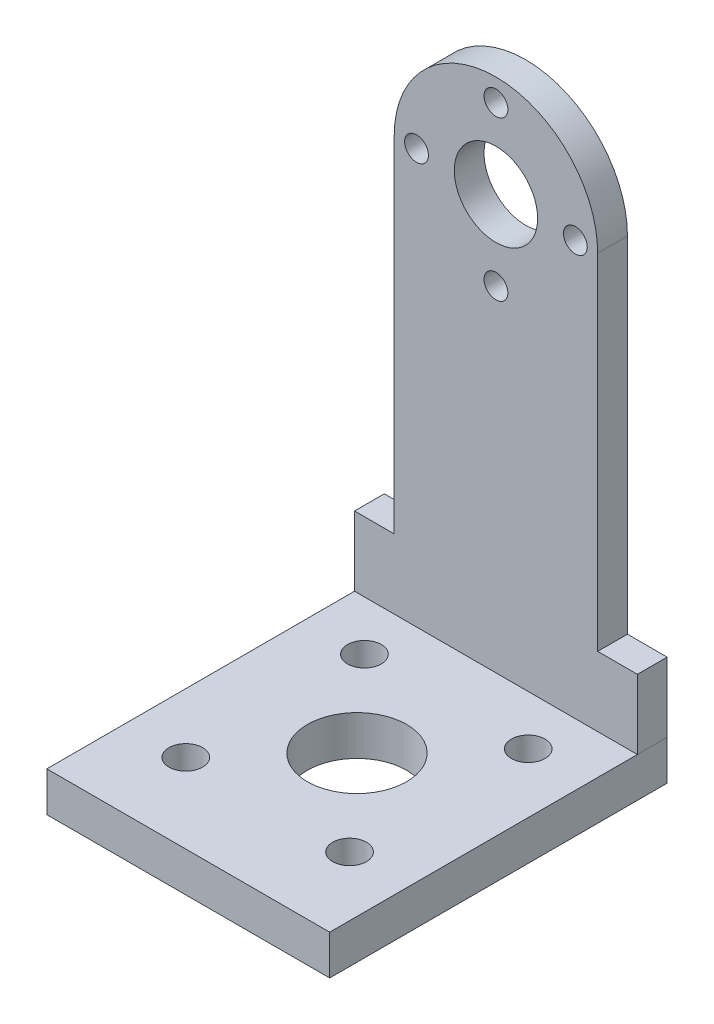
ISO-10303-21;
HEADER;
FILE_DESCRIPTION(('STEP AP214'),'2;1');
FILE_NAME('part.step','',(''),(''),'','','');
FILE_SCHEMA(('AUTOMOTIVE_DESIGN { 1 0 10303 214 1 1 1 1 }'));
ENDSEC;
DATA;
#1=APPLICATION_CONTEXT('core data for automotive mechanical design processes');
#2=APPLICATION_PROTOCOL_DEFINITION('international standard','automotive_design',2000,#1);
#3=PRODUCT_CONTEXT('',#1,'mechanical');
#4=PRODUCT('Part','Part','',(#3));
#5=PRODUCT_RELATED_PRODUCT_CATEGORY('part','',(#4));
#6=PRODUCT_DEFINITION_FORMATION('','',#4);
#7=PRODUCT_DEFINITION_CONTEXT('part definition',#1,'design');
#8=PRODUCT_DEFINITION('design','',#6,#7);
#9=PRODUCT_DEFINITION_SHAPE('','',#8);
#10=(LENGTH_UNIT() NAMED_UNIT(*) SI_UNIT(.MILLI.,.METRE.));
#11=(NAMED_UNIT(*) PLANE_ANGLE_UNIT() SI_UNIT($,.RADIAN.));
#12=(NAMED_UNIT(*) SI_UNIT($,.STERADIAN.) SOLID_ANGLE_UNIT());
#13=UNCERTAINTY_MEASURE_WITH_UNIT(LENGTH_MEASURE(1.E-05),#10,'distance_accuracy_value','');
#14=(GEOMETRIC_REPRESENTATION_CONTEXT(3) GLOBAL_UNCERTAINTY_ASSIGNED_CONTEXT((#13)) GLOBAL_UNIT_ASSIGNED_CONTEXT((#10,
#11,#12)) REPRESENTATION_CONTEXT('',''));
#15=CARTESIAN_POINT('',(0.,0.,0.));
#16=DIRECTION('',(0.,0.,1.));
#17=DIRECTION('',(1.,0.,0.));
#18=AXIS2_PLACEMENT_3D('',#15,#16,#17);
#19=CARTESIAN_POINT('',(0.,0.,-14.));
#20=DIRECTION('',(0.,0.,-1.));
#21=DIRECTION('',(-1.,0.,0.));
#22=AXIS2_PLACEMENT_3D('',#19,#20,#21);
#23=CYLINDRICAL_SURFACE('',#22,10.25);
#24=CARTESIAN_POINT('',(0.,0.,-17.));
#25=DIRECTION('',(0.,0.,1.));
#26=DIRECTION('',(1.,0.,0.));
#27=AXIS2_PLACEMENT_3D('',#24,#25,#26);
#28=CIRCLE('',#27,10.25);
#29=CARTESIAN_POINT('',(10.25,0.,-17.));
#30=VERTEX_POINT('',#29);
#31=CARTESIAN_POINT('',(-10.25,0.,-17.));
#32=VERTEX_POINT('',#31);
#33=EDGE_CURVE('E170',#30,#32,#28,.T.);
#34=ORIENTED_EDGE('',*,*,#33,.T.);
#35=DIRECTION('',(0.,0.,-1.));
#36=VECTOR('',#35,1.);
#37=CARTESIAN_POINT('',(-10.25,0.,-14.));
#38=LINE('',#37,#36);
#39=CARTESIAN_POINT('',(-10.25,0.,-14.));
#40=VERTEX_POINT('',#39);
#41=EDGE_CURVE('E12',#40,#32,#38,.T.);
#42=ORIENTED_EDGE('',*,*,#41,.F.);
#43=CARTESIAN_POINT('',(0.,0.,-14.));
#44=DIRECTION('',(0.,0.,1.));
#45=DIRECTION('',(1.,0.,0.));
#46=AXIS2_PLACEMENT_3D('',#43,#44,#45);
#47=CIRCLE('',#46,10.25);
#48=CARTESIAN_POINT('',(10.25,0.,-14.));
#49=VERTEX_POINT('',#48);
#50=EDGE_CURVE('E201',#49,#40,#47,.T.);
#51=ORIENTED_EDGE('',*,*,#50,.F.);
#52=DIRECTION('',(0.,0.,-1.));
#53=VECTOR('',#52,1.);
#54=CARTESIAN_POINT('',(10.25,0.,-14.));
#55=LINE('',#54,#53);
#56=EDGE_CURVE('E73',#49,#30,#55,.T.);
#57=ORIENTED_EDGE('',*,*,#56,.T.);
#58=EDGE_LOOP('',(#34,#42,#51,#57));
#59=FACE_BOUND('',#58,.T.);
#60=ADVANCED_FACE('F57',(#59),#23,.T.);
#61=CARTESIAN_POINT('',(-10.25,0.,-14.));
#62=DIRECTION('',(1.,0.,0.));
#63=DIRECTION('',(0.,0.,-1.));
#64=AXIS2_PLACEMENT_3D('',#61,#62,#63);
#65=PLANE('',#64);
#66=DIRECTION('',(0.,-1.,0.));
#67=VECTOR('',#66,1.);
#68=CARTESIAN_POINT('',(-10.25,0.,-17.));
#69=LINE('',#68,#67);
#70=CARTESIAN_POINT('',(-10.25,-34.75,-17.));
#71=VERTEX_POINT('',#70);
#72=EDGE_CURVE('E172',#32,#71,#69,.T.);
#73=ORIENTED_EDGE('',*,*,#72,.T.);
#74=DIRECTION('',(0.,0.,-1.));
#75=VECTOR('',#74,1.);
#76=CARTESIAN_POINT('',(-10.25,-34.75,-14.));
#77=LINE('',#76,#75);
#78=CARTESIAN_POINT('',(-10.25,-34.75,-14.));
#79=VERTEX_POINT('',#78);
#80=EDGE_CURVE('E65',#79,#71,#77,.T.);
#81=ORIENTED_EDGE('',*,*,#80,.F.);
#82=DIRECTION('',(0.,-1.,0.));
#83=VECTOR('',#82,1.);
#84=CARTESIAN_POINT('',(-10.25,0.,-14.));
#85=LINE('',#84,#83);
#86=EDGE_CURVE('E112',#40,#79,#85,.T.);
#87=ORIENTED_EDGE('',*,*,#86,.F.);
#88=ORIENTED_EDGE('',*,*,#41,.T.);
#89=EDGE_LOOP('',(#73,#81,#87,#88));
#90=FACE_BOUND('',#89,.T.);
#91=ADVANCED_FACE('F234',(#90),#65,.F.);
#92=CARTESIAN_POINT('',(0.,-34.75,-14.));
#93=DIRECTION('',(0.,-1.,0.));
#94=DIRECTION('',(0.,0.,-1.));
#95=AXIS2_PLACEMENT_3D('',#92,#93,#94);
#96=PLANE('',#95);
#97=DIRECTION('',(-1.,0.,0.));
#98=VECTOR('',#97,1.);
#99=CARTESIAN_POINT('',(0.,-34.75,-17.));
#100=LINE('',#99,#98);
#101=CARTESIAN_POINT('',(-14.25,-34.75,-17.));
#102=VERTEX_POINT('',#101);
#103=EDGE_CURVE('E174',#71,#102,#100,.T.);
#104=ORIENTED_EDGE('',*,*,#103,.T.);
#105=DIRECTION('',(0.,0.,-1.));
#106=VECTOR('',#105,1.);
#107=CARTESIAN_POINT('',(-14.25,-34.75,-14.));
#108=LINE('',#107,#106);
#109=CARTESIAN_POINT('',(-14.25,-34.75,-14.));
#110=VERTEX_POINT('',#109);
#111=EDGE_CURVE('E208',#110,#102,#108,.T.);
#112=ORIENTED_EDGE('',*,*,#111,.F.);
#113=DIRECTION('',(-1.,0.,0.));
#114=VECTOR('',#113,1.);
#115=CARTESIAN_POINT('',(0.,-34.75,-14.));
#116=LINE('',#115,#114);
#117=EDGE_CURVE('E216',#79,#110,#116,.T.);
#118=ORIENTED_EDGE('',*,*,#117,.F.);
#119=ORIENTED_EDGE('',*,*,#80,.T.);
#120=EDGE_LOOP('',(#104,#112,#118,#119));
#121=FACE_BOUND('',#120,.T.);
#122=ADVANCED_FACE('F214',(#121),#96,.F.);
#123=CARTESIAN_POINT('',(-14.25,0.,-14.));
#124=DIRECTION('',(1.,0.,0.));
#125=DIRECTION('',(0.,1.,0.));
#126=AXIS2_PLACEMENT_3D('',#123,#124,#125);
#127=PLANE('',#126);
#128=DIRECTION('',(0.,-1.,0.));
#129=VECTOR('',#128,1.);
#130=CARTESIAN_POINT('',(-14.25,0.,-17.));
#131=LINE('',#130,#129);
#132=CARTESIAN_POINT('',(-14.25,-41.75,-17.));
#133=VERTEX_POINT('',#132);
#134=EDGE_CURVE('E176',#102,#133,#131,.T.);
#135=ORIENTED_EDGE('',*,*,#134,.T.);
#136=DIRECTION('',(0.,0.,-1.));
#137=VECTOR('',#136,1.);
#138=CARTESIAN_POINT('',(-14.25,-41.75,-14.));
#139=LINE('',#138,#137);
#140=CARTESIAN_POINT('',(-14.25,-41.75,-14.));
#141=VERTEX_POINT('',#140);
#142=EDGE_CURVE('E205',#141,#133,#139,.T.);
#143=ORIENTED_EDGE('',*,*,#142,.F.);
#144=DIRECTION('',(0.,-1.,0.));
#145=VECTOR('',#144,1.);
#146=CARTESIAN_POINT('',(-14.25,0.,-14.));
#147=LINE('',#146,#145);
#148=EDGE_CURVE('E228',#110,#141,#147,.T.);
#149=ORIENTED_EDGE('',*,*,#148,.F.);
#150=ORIENTED_EDGE('',*,*,#111,.T.);
#151=EDGE_LOOP('',(#135,#143,#149,#150));
#152=FACE_BOUND('',#151,.T.);
#153=ADVANCED_FACE('F224',(#152),#127,.F.);
#154=CARTESIAN_POINT('',(0.,-41.75,-14.));
#155=DIRECTION('',(0.,1.,0.));
#156=DIRECTION('',(0.,0.,1.));
#157=AXIS2_PLACEMENT_3D('',#154,#155,#156);
#158=PLANE('',#157);
#159=DIRECTION('',(1.,0.,0.));
#160=VECTOR('',#159,1.);
#161=CARTESIAN_POINT('',(0.,-41.75,-17.));
#162=LINE('',#161,#160);
#163=CARTESIAN_POINT('',(14.25,-41.75,-17.));
#164=VERTEX_POINT('',#163);
#165=EDGE_CURVE('E178',#133,#164,#162,.T.);
#166=ORIENTED_EDGE('',*,*,#165,.T.);
#167=DIRECTION('',(0.,0.,-1.));
#168=VECTOR('',#167,1.);
#169=CARTESIAN_POINT('',(14.25,-41.75,-14.));
#170=LINE('',#169,#168);
#171=CARTESIAN_POINT('',(14.25,-41.75,-14.));
#172=VERTEX_POINT('',#171);
#173=EDGE_CURVE('E147',#172,#164,#170,.T.);
#174=ORIENTED_EDGE('',*,*,#173,.F.);
#175=DIRECTION('',(1.,0.,0.));
#176=VECTOR('',#175,1.);
#177=CARTESIAN_POINT('',(0.,-41.75,-14.));
#178=LINE('',#177,#176);
#179=EDGE_CURVE('E135',#141,#172,#178,.T.);
#180=ORIENTED_EDGE('',*,*,#179,.F.);
#181=ORIENTED_EDGE('',*,*,#142,.T.);
#182=EDGE_LOOP('',(#166,#174,#180,#181));
#183=FACE_BOUND('',#182,.T.);
#184=ADVANCED_FACE('F227',(#183),#158,.F.);
#185=CARTESIAN_POINT('',(14.25,0.,-14.));
#186=DIRECTION('',(-1.,0.,0.));
#187=DIRECTION('',(0.,-1.,0.));
#188=AXIS2_PLACEMENT_3D('',#185,#186,#187);
#189=PLANE('',#188);
#190=DIRECTION('',(0.,1.,0.));
#191=VECTOR('',#190,1.);
#192=CARTESIAN_POINT('',(14.25,0.,-17.));
#193=LINE('',#192,#191);
#194=CARTESIAN_POINT('',(14.25,-34.75,-17.));
#195=VERTEX_POINT('',#194);
#196=EDGE_CURVE('E144',#164,#195,#193,.T.);
#197=ORIENTED_EDGE('',*,*,#196,.T.);
#198=DIRECTION('',(0.,0.,-1.));
#199=VECTOR('',#198,1.);
#200=CARTESIAN_POINT('',(14.25,-34.75,-14.));
#201=LINE('',#200,#199);
#202=CARTESIAN_POINT('',(14.25,-34.75,-14.));
#203=VERTEX_POINT('',#202);
#204=EDGE_CURVE('E141',#203,#195,#201,.T.);
#205=ORIENTED_EDGE('',*,*,#204,.F.);
#206=DIRECTION('',(0.,1.,0.));
#207=VECTOR('',#206,1.);
#208=CARTESIAN_POINT('',(14.25,0.,-14.));
#209=LINE('',#208,#207);
#210=EDGE_CURVE('E127',#172,#203,#209,.T.);
#211=ORIENTED_EDGE('',*,*,#210,.F.);
#212=ORIENTED_EDGE('',*,*,#173,.T.);
#213=EDGE_LOOP('',(#197,#205,#211,#212));
#214=FACE_BOUND('',#213,.T.);
#215=ADVANCED_FACE('F142',(#214),#189,.F.);
#216=CARTESIAN_POINT('',(0.,-34.75,-14.));
#217=DIRECTION('',(0.,-1.,0.));
#218=DIRECTION('',(0.,0.,-1.));
#219=AXIS2_PLACEMENT_3D('',#216,#217,#218);
#220=PLANE('',#219);
#221=DIRECTION('',(-1.,0.,0.));
#222=VECTOR('',#221,1.);
#223=CARTESIAN_POINT('',(0.,-34.75,-17.));
#224=LINE('',#223,#222);
#225=CARTESIAN_POINT('',(10.25,-34.75,-17.));
#226=VERTEX_POINT('',#225);
#227=EDGE_CURVE('E181',#195,#226,#224,.T.);
#228=ORIENTED_EDGE('',*,*,#227,.T.);
#229=DIRECTION('',(0.,0.,-1.));
#230=VECTOR('',#229,1.);
#231=CARTESIAN_POINT('',(10.25,-34.75,-14.));
#232=LINE('',#231,#230);
#233=CARTESIAN_POINT('',(10.25,-34.75,-14.));
#234=VERTEX_POINT('',#233);
#235=EDGE_CURVE('E100',#234,#226,#232,.T.);
#236=ORIENTED_EDGE('',*,*,#235,.F.);
#237=DIRECTION('',(-1.,0.,0.));
#238=VECTOR('',#237,1.);
#239=CARTESIAN_POINT('',(0.,-34.75,-14.));
#240=LINE('',#239,#238);
#241=EDGE_CURVE('E133',#203,#234,#240,.T.);
#242=ORIENTED_EDGE('',*,*,#241,.F.);
#243=ORIENTED_EDGE('',*,*,#204,.T.);
#244=EDGE_LOOP('',(#228,#236,#242,#243));
#245=FACE_BOUND('',#244,.T.);
#246=ADVANCED_FACE('F149',(#245),#220,.F.);
#247=CARTESIAN_POINT('',(0.,-8.,-14.));
#248=DIRECTION('',(0.,0.,-1.));
#249=DIRECTION('',(-1.,0.,0.));
#250=AXIS2_PLACEMENT_3D('',#247,#248,#249);
#251=CYLINDRICAL_SURFACE('',#250,1.2);
#252=CARTESIAN_POINT('',(0.,-8.,-14.));
#253=DIRECTION('',(0.,0.,1.));
#254=DIRECTION('',(1.,0.,0.));
#255=AXIS2_PLACEMENT_3D('',#252,#253,#254);
#256=CIRCLE('',#255,1.2);
#257=CARTESIAN_POINT('',(1.19999999999994,-8.,-14.));
#258=VERTEX_POINT('',#257);
#259=EDGE_CURVE('E164',#258,#258,#256,.T.);
#260=ORIENTED_EDGE('',*,*,#259,.T.);
#261=EDGE_LOOP('',(#260));
#262=FACE_BOUND('',#261,.T.);
#263=CARTESIAN_POINT('',(0.,-8.,-17.));
#264=DIRECTION('',(0.,0.,1.));
#265=DIRECTION('',(1.,0.,0.));
#266=AXIS2_PLACEMENT_3D('',#263,#264,#265);
#267=CIRCLE('',#266,1.2);
#268=CARTESIAN_POINT('',(1.19999999999994,-8.,-17.));
#269=VERTEX_POINT('',#268);
#270=EDGE_CURVE('E195',#269,#269,#267,.T.);
#271=ORIENTED_EDGE('',*,*,#270,.F.);
#272=EDGE_LOOP('',(#271));
#273=FACE_BOUND('',#272,.T.);
#274=ADVANCED_FACE('F250',(#262,#273),#251,.F.);
#275=CARTESIAN_POINT('',(-8.,0.,-14.));
#276=DIRECTION('',(0.,0.,-1.));
#277=DIRECTION('',(-1.,0.,0.));
#278=AXIS2_PLACEMENT_3D('',#275,#276,#277);
#279=CYLINDRICAL_SURFACE('',#278,1.2);
#280=CARTESIAN_POINT('',(-8.,0.,-14.));
#281=DIRECTION('',(0.,0.,1.));
#282=DIRECTION('',(1.,0.,0.));
#283=AXIS2_PLACEMENT_3D('',#280,#281,#282);
#284=CIRCLE('',#283,1.2);
#285=CARTESIAN_POINT('',(-6.8,0.,-14.));
#286=VERTEX_POINT('',#285);
#287=EDGE_CURVE('E161',#286,#286,#284,.T.);
#288=ORIENTED_EDGE('',*,*,#287,.T.);
#289=EDGE_LOOP('',(#288));
#290=FACE_BOUND('',#289,.T.);
#291=CARTESIAN_POINT('',(-8.,0.,-17.));
#292=DIRECTION('',(0.,0.,1.));
#293=DIRECTION('',(1.,0.,0.));
#294=AXIS2_PLACEMENT_3D('',#291,#292,#293);
#295=CIRCLE('',#294,1.2);
#296=CARTESIAN_POINT('',(-6.8,0.,-17.));
#297=VERTEX_POINT('',#296);
#298=EDGE_CURVE('E192',#297,#297,#295,.T.);
#299=ORIENTED_EDGE('',*,*,#298,.F.);
#300=EDGE_LOOP('',(#299));
#301=FACE_BOUND('',#300,.T.);
#302=ADVANCED_FACE('F262',(#290,#301),#279,.F.);
#303=CARTESIAN_POINT('',(0.,0.,-14.));
#304=DIRECTION('',(0.,0.,-1.));
#305=DIRECTION('',(-1.,0.,0.));
#306=AXIS2_PLACEMENT_3D('',#303,#304,#305);
#307=CYLINDRICAL_SURFACE('',#306,4.2);
#308=CARTESIAN_POINT('',(0.,0.,-14.));
#309=DIRECTION('',(0.,0.,1.));
#310=DIRECTION('',(1.,0.,0.));
#311=AXIS2_PLACEMENT_3D('',#308,#309,#310);
#312=CIRCLE('',#311,4.2);
#313=CARTESIAN_POINT('',(4.2,0.,-14.));
#314=VERTEX_POINT('',#313);
#315=EDGE_CURVE('E158',#314,#314,#312,.T.);
#316=ORIENTED_EDGE('',*,*,#315,.T.);
#317=EDGE_LOOP('',(#316));
#318=FACE_BOUND('',#317,.T.);
#319=CARTESIAN_POINT('',(0.,0.,-17.));
#320=DIRECTION('',(0.,0.,1.));
#321=DIRECTION('',(1.,0.,0.));
#322=AXIS2_PLACEMENT_3D('',#319,#320,#321);
#323=CIRCLE('',#322,4.2);
#324=CARTESIAN_POINT('',(4.2,0.,-17.));
#325=VERTEX_POINT('',#324);
#326=EDGE_CURVE('E189',#325,#325,#323,.T.);
#327=ORIENTED_EDGE('',*,*,#326,.F.);
#328=EDGE_LOOP('',(#327));
#329=FACE_BOUND('',#328,.T.);
#330=ADVANCED_FACE('F258',(#318,#329),#307,.F.);
#331=CARTESIAN_POINT('',(8.,0.,-14.));
#332=DIRECTION('',(0.,0.,-1.));
#333=DIRECTION('',(-1.,0.,0.));
#334=AXIS2_PLACEMENT_3D('',#331,#332,#333);
#335=CYLINDRICAL_SURFACE('',#334,1.2);
#336=CARTESIAN_POINT('',(8.,0.,-14.));
#337=DIRECTION('',(0.,0.,1.));
#338=DIRECTION('',(1.,0.,0.));
#339=AXIS2_PLACEMENT_3D('',#336,#337,#338);
#340=CIRCLE('',#339,1.2);
#341=CARTESIAN_POINT('',(9.2,0.,-14.));
#342=VERTEX_POINT('',#341);
#343=EDGE_CURVE('E152',#342,#342,#340,.T.);
#344=ORIENTED_EDGE('',*,*,#343,.T.);
#345=EDGE_LOOP('',(#344));
#346=FACE_BOUND('',#345,.T.);
#347=CARTESIAN_POINT('',(8.,0.,-17.));
#348=DIRECTION('',(0.,0.,1.));
#349=DIRECTION('',(1.,0.,0.));
#350=AXIS2_PLACEMENT_3D('',#347,#348,#349);
#351=CIRCLE('',#350,1.2);
#352=CARTESIAN_POINT('',(9.2,0.,-17.));
#353=VERTEX_POINT('',#352);
#354=EDGE_CURVE('E186',#353,#353,#351,.T.);
#355=ORIENTED_EDGE('',*,*,#354,.F.);
#356=EDGE_LOOP('',(#355));
#357=FACE_BOUND('',#356,.T.);
#358=ADVANCED_FACE('F255',(#346,#357),#335,.F.);
#359=CARTESIAN_POINT('',(10.25,0.,-14.));
#360=DIRECTION('',(1.,0.,0.));
#361=DIRECTION('',(0.,0.,-1.));
#362=AXIS2_PLACEMENT_3D('',#359,#360,#361);
#363=PLANE('',#362);
#364=DIRECTION('',(0.,-1.,0.));
#365=VECTOR('',#364,1.);
#366=CARTESIAN_POINT('',(10.25,0.,-17.));
#367=LINE('',#366,#365);
#368=EDGE_CURVE('E183',#30,#226,#367,.T.);
#369=ORIENTED_EDGE('',*,*,#368,.F.);
#370=ORIENTED_EDGE('',*,*,#56,.F.);
#371=DIRECTION('',(0.,-1.,0.));
#372=VECTOR('',#371,1.);
#373=CARTESIAN_POINT('',(10.25,0.,-14.));
#374=LINE('',#373,#372);
#375=EDGE_CURVE('E150',#49,#234,#374,.T.);
#376=ORIENTED_EDGE('',*,*,#375,.T.);
#377=ORIENTED_EDGE('',*,*,#235,.T.);
#378=EDGE_LOOP('',(#369,#370,#376,#377));
#379=FACE_BOUND('',#378,.T.);
#380=ADVANCED_FACE('F251',(#379),#363,.T.);
#381=CARTESIAN_POINT('',(0.,8.,-14.));
#382=DIRECTION('',(0.,0.,-1.));
#383=DIRECTION('',(-1.,0.,0.));
#384=AXIS2_PLACEMENT_3D('',#381,#382,#383);
#385=CYLINDRICAL_SURFACE('',#384,1.2);
#386=CARTESIAN_POINT('',(0.,8.,-14.));
#387=DIRECTION('',(0.,0.,1.));
#388=DIRECTION('',(1.,0.,0.));
#389=AXIS2_PLACEMENT_3D('',#386,#387,#388);
#390=CIRCLE('',#389,1.2);
#391=CARTESIAN_POINT('',(1.2,8.,-14.));
#392=VERTEX_POINT('',#391);
#393=EDGE_CURVE('E167',#392,#392,#390,.T.);
#394=ORIENTED_EDGE('',*,*,#393,.T.);
#395=EDGE_LOOP('',(#394));
#396=FACE_BOUND('',#395,.T.);
#397=CARTESIAN_POINT('',(0.,8.,-17.));
#398=DIRECTION('',(0.,0.,1.));
#399=DIRECTION('',(1.,0.,0.));
#400=AXIS2_PLACEMENT_3D('',#397,#398,#399);
#401=CIRCLE('',#400,1.2);
#402=CARTESIAN_POINT('',(1.2,8.,-17.));
#403=VERTEX_POINT('',#402);
#404=EDGE_CURVE('E198',#403,#403,#401,.T.);
#405=ORIENTED_EDGE('',*,*,#404,.F.);
#406=EDGE_LOOP('',(#405));
#407=FACE_BOUND('',#406,.T.);
#408=ADVANCED_FACE('F254',(#396,#407),#385,.F.);
#409=CARTESIAN_POINT('',(0.,0.,-14.));
#410=DIRECTION('',(0.,0.,1.));
#411=DIRECTION('',(1.,0.,0.));
#412=AXIS2_PLACEMENT_3D('',#409,#410,#411);
#413=PLANE('',#412);
#414=ORIENTED_EDGE('',*,*,#50,.T.);
#415=ORIENTED_EDGE('',*,*,#86,.T.);
#416=ORIENTED_EDGE('',*,*,#117,.T.);
#417=ORIENTED_EDGE('',*,*,#148,.T.);
#418=ORIENTED_EDGE('',*,*,#179,.T.);
#419=ORIENTED_EDGE('',*,*,#210,.T.);
#420=ORIENTED_EDGE('',*,*,#241,.T.);
#421=ORIENTED_EDGE('',*,*,#375,.F.);
#422=EDGE_LOOP('',(#414,#415,#416,#417,#418,#419,#420,#421));
#423=FACE_BOUND('',#422,.T.);
#424=ORIENTED_EDGE('',*,*,#343,.F.);
#425=EDGE_LOOP('',(#424));
#426=FACE_BOUND('',#425,.T.);
#427=ORIENTED_EDGE('',*,*,#315,.F.);
#428=EDGE_LOOP('',(#427));
#429=FACE_BOUND('',#428,.T.);
#430=ORIENTED_EDGE('',*,*,#287,.F.);
#431=EDGE_LOOP('',(#430));
#432=FACE_BOUND('',#431,.T.);
#433=ORIENTED_EDGE('',*,*,#259,.F.);
#434=EDGE_LOOP('',(#433));
#435=FACE_BOUND('',#434,.T.);
#436=ORIENTED_EDGE('',*,*,#393,.F.);
#437=EDGE_LOOP('',(#436));
#438=FACE_BOUND('',#437,.T.);
#439=ADVANCED_FACE('F129',(#423,#426,#429,#432,#435,#438),#413,.T.);
#440=CARTESIAN_POINT('',(0.,0.,-17.));
#441=DIRECTION('',(0.,0.,1.));
#442=DIRECTION('',(1.,0.,0.));
#443=AXIS2_PLACEMENT_3D('',#440,#441,#442);
#444=PLANE('',#443);
#445=ORIENTED_EDGE('',*,*,#33,.F.);
#446=ORIENTED_EDGE('',*,*,#368,.T.);
#447=ORIENTED_EDGE('',*,*,#227,.F.);
#448=ORIENTED_EDGE('',*,*,#196,.F.);
#449=ORIENTED_EDGE('',*,*,#165,.F.);
#450=ORIENTED_EDGE('',*,*,#134,.F.);
#451=ORIENTED_EDGE('',*,*,#103,.F.);
#452=ORIENTED_EDGE('',*,*,#72,.F.);
#453=EDGE_LOOP('',(#445,#446,#447,#448,#449,#450,#451,#452));
#454=FACE_BOUND('',#453,.T.);
#455=ORIENTED_EDGE('',*,*,#354,.T.);
#456=EDGE_LOOP('',(#455));
#457=FACE_BOUND('',#456,.T.);
#458=ORIENTED_EDGE('',*,*,#326,.T.);
#459=EDGE_LOOP('',(#458));
#460=FACE_BOUND('',#459,.T.);
#461=ORIENTED_EDGE('',*,*,#298,.T.);
#462=EDGE_LOOP('',(#461));
#463=FACE_BOUND('',#462,.T.);
#464=ORIENTED_EDGE('',*,*,#270,.T.);
#465=EDGE_LOOP('',(#464));
#466=FACE_BOUND('',#465,.T.);
#467=ORIENTED_EDGE('',*,*,#404,.T.);
#468=EDGE_LOOP('',(#467));
#469=FACE_BOUND('',#468,.T.);
#470=ADVANCED_FACE('F219',(#454,#457,#460,#463,#466,#469),#444,.F.);
#471=CLOSED_SHELL('',(#60,#91,#122,#153,#184,#215,#246,#274,#302,#330,#358,#380,#408,#439,#470));
#472=MANIFOLD_SOLID_BREP('B2',#471);
#473=CARTESIAN_POINT('',(0.,-45.75,0.));
#474=DIRECTION('',(0.,-1.,0.));
#475=DIRECTION('',(0.,0.,-1.));
#476=AXIS2_PLACEMENT_3D('',#473,#474,#475);
#477=PLANE('',#476);
#478=DIRECTION('',(-1.,0.,0.));
#479=VECTOR('',#478,1.);
#480=CARTESIAN_POINT('',(14.25,-45.75,-17.));
#481=LINE('',#480,#479);
#482=CARTESIAN_POINT('',(14.25,-45.75,-17.));
#483=VERTEX_POINT('',#482);
#484=CARTESIAN_POINT('',(-14.25,-45.75,-17.));
#485=VERTEX_POINT('',#484);
#486=EDGE_CURVE('E490',#483,#485,#481,.T.);
#487=ORIENTED_EDGE('',*,*,#486,.F.);
#488=DIRECTION('',(0.,0.,-1.));
#489=VECTOR('',#488,1.);
#490=CARTESIAN_POINT('',(14.25,-45.75,0.));
#491=LINE('',#490,#489);
#492=CARTESIAN_POINT('',(14.25,-45.75,17.));
#493=VERTEX_POINT('',#492);
#494=EDGE_CURVE('E513',#493,#483,#491,.T.);
#495=ORIENTED_EDGE('',*,*,#494,.F.);
#496=DIRECTION('',(1.,0.,0.));
#497=VECTOR('',#496,1.);
#498=CARTESIAN_POINT('',(-14.25,-45.75,17.));
#499=LINE('',#498,#497);
#500=CARTESIAN_POINT('',(-14.25,-45.75,17.));
#501=VERTEX_POINT('',#500);
#502=EDGE_CURVE('E510',#501,#493,#499,.T.);
#503=ORIENTED_EDGE('',*,*,#502,.F.);
#504=DIRECTION('',(0.,0.,-1.));
#505=VECTOR('',#504,1.);
#506=CARTESIAN_POINT('',(-14.25,-45.75,0.));
#507=LINE('',#506,#505);
#508=EDGE_CURVE('E453',#501,#485,#507,.T.);
#509=ORIENTED_EDGE('',*,*,#508,.T.);
#510=EDGE_LOOP('',(#487,#495,#503,#509));
#511=FACE_BOUND('',#510,.T.);
#512=CARTESIAN_POINT('',(-8.24999999999981,-45.75,-8.99999999999999));
#513=DIRECTION('',(0.,-1.,0.));
#514=DIRECTION('',(0.,0.,-1.));
#515=AXIS2_PLACEMENT_3D('',#512,#513,#514);
#516=CIRCLE('',#515,1.7);
#517=CARTESIAN_POINT('',(-8.24999999999981,-45.75,-10.7));
#518=VERTEX_POINT('',#517);
#519=EDGE_CURVE('E537',#518,#518,#516,.T.);
#520=ORIENTED_EDGE('',*,*,#519,.F.);
#521=EDGE_LOOP('',(#520));
#522=FACE_BOUND('',#521,.T.);
#523=CARTESIAN_POINT('',(8.2500000000002,-45.75,-8.99999999999999));
#524=DIRECTION('',(0.,-1.,0.));
#525=DIRECTION('',(0.,0.,-1.));
#526=AXIS2_PLACEMENT_3D('',#523,#524,#525);
#527=CIRCLE('',#526,1.7);
#528=CARTESIAN_POINT('',(8.2500000000002,-45.75,-10.7));
#529=VERTEX_POINT('',#528);
#530=EDGE_CURVE('E533',#529,#529,#527,.T.);
#531=ORIENTED_EDGE('',*,*,#530,.F.);
#532=EDGE_LOOP('',(#531));
#533=FACE_BOUND('',#532,.T.);
#534=CARTESIAN_POINT('',(8.25000000000001,-45.75,9.00000000000001));
#535=DIRECTION('',(0.,-1.,0.));
#536=DIRECTION('',(0.,0.,-1.));
#537=AXIS2_PLACEMENT_3D('',#534,#535,#536);
#538=CIRCLE('',#537,1.7);
#539=CARTESIAN_POINT('',(8.25000000000001,-45.75,7.30000000000001));
#540=VERTEX_POINT('',#539);
#541=EDGE_CURVE('E529',#540,#540,#538,.T.);
#542=ORIENTED_EDGE('',*,*,#541,.F.);
#543=EDGE_LOOP('',(#542));
#544=FACE_BOUND('',#543,.T.);
#545=CARTESIAN_POINT('',(-8.24999999999999,-45.75,9.00000000000001));
#546=DIRECTION('',(0.,-1.,0.));
#547=DIRECTION('',(0.,0.,-1.));
#548=AXIS2_PLACEMENT_3D('',#545,#546,#547);
#549=CIRCLE('',#548,1.7);
#550=CARTESIAN_POINT('',(-8.24999999999999,-45.75,7.30000000000001));
#551=VERTEX_POINT('',#550);
#552=EDGE_CURVE('E523',#551,#551,#549,.T.);
#553=ORIENTED_EDGE('',*,*,#552,.F.);
#554=EDGE_LOOP('',(#553));
#555=FACE_BOUND('',#554,.T.);
#556=CARTESIAN_POINT('',(0.,-45.75,0.));
#557=DIRECTION('',(0.,-1.,0.));
#558=DIRECTION('',(0.,0.,-1.));
#559=AXIS2_PLACEMENT_3D('',#556,#557,#558);
#560=CIRCLE('',#559,5.);
#561=CARTESIAN_POINT('',(0.,-45.75,-5.));
#562=VERTEX_POINT('',#561);
#563=EDGE_CURVE('E519',#562,#562,#560,.T.);
#564=ORIENTED_EDGE('',*,*,#563,.F.);
#565=EDGE_LOOP('',(#564));
#566=FACE_BOUND('',#565,.T.);
#567=ADVANCED_FACE('F450',(#511,#522,#533,#544,#555,#566),#477,.T.);
#568=CARTESIAN_POINT('',(14.25,-41.75,0.));
#569=DIRECTION('',(-1.,0.,0.));
#570=DIRECTION('',(0.,0.,1.));
#571=AXIS2_PLACEMENT_3D('',#568,#569,#570);
#572=PLANE('',#571);
#573=ORIENTED_EDGE('',*,*,#494,.T.);
#574=DIRECTION('',(0.,1.,0.));
#575=VECTOR('',#574,1.);
#576=CARTESIAN_POINT('',(14.25,10.25,-17.));
#577=LINE('',#576,#575);
#578=CARTESIAN_POINT('',(14.25,-41.75,-17.));
#579=VERTEX_POINT('',#578);
#580=EDGE_CURVE('E493',#483,#579,#577,.T.);
#581=ORIENTED_EDGE('',*,*,#580,.T.);
#582=DIRECTION('',(0.,0.,-1.));
#583=VECTOR('',#582,1.);
#584=CARTESIAN_POINT('',(14.25,-41.75,0.));
#585=LINE('',#584,#583);
#586=CARTESIAN_POINT('',(14.25,-41.75,17.));
#587=VERTEX_POINT('',#586);
#588=EDGE_CURVE('E546',#587,#579,#585,.T.);
#589=ORIENTED_EDGE('',*,*,#588,.F.);
#590=DIRECTION('',(0.,1.,0.));
#591=VECTOR('',#590,1.);
#592=CARTESIAN_POINT('',(14.25,0.,17.));
#593=LINE('',#592,#591);
#594=EDGE_CURVE('E467',#493,#587,#593,.T.);
#595=ORIENTED_EDGE('',*,*,#594,.F.);
#596=EDGE_LOOP('',(#573,#581,#589,#595));
#597=FACE_BOUND('',#596,.T.);
#598=ADVANCED_FACE('F574',(#597),#572,.F.);
#599=CARTESIAN_POINT('',(-14.25,-41.75,0.));
#600=DIRECTION('',(-1.,0.,0.));
#601=DIRECTION('',(0.,0.,1.));
#602=AXIS2_PLACEMENT_3D('',#599,#600,#601);
#603=PLANE('',#602);
#604=DIRECTION('',(0.,1.,0.));
#605=VECTOR('',#604,1.);
#606=CARTESIAN_POINT('',(-14.25,10.25,-17.));
#607=LINE('',#606,#605);
#608=CARTESIAN_POINT('',(-14.25,-41.75,-17.));
#609=VERTEX_POINT('',#608);
#610=EDGE_CURVE('E474',#485,#609,#607,.T.);
#611=ORIENTED_EDGE('',*,*,#610,.F.);
#612=ORIENTED_EDGE('',*,*,#508,.F.);
#613=DIRECTION('',(0.,1.,0.));
#614=VECTOR('',#613,1.);
#615=CARTESIAN_POINT('',(-14.25,0.,17.));
#616=LINE('',#615,#614);
#617=CARTESIAN_POINT('',(-14.25,-41.75,17.));
#618=VERTEX_POINT('',#617);
#619=EDGE_CURVE('E567',#501,#618,#616,.T.);
#620=ORIENTED_EDGE('',*,*,#619,.T.);
#621=DIRECTION('',(0.,0.,-1.));
#622=VECTOR('',#621,1.);
#623=CARTESIAN_POINT('',(-14.25,-41.75,0.));
#624=LINE('',#623,#622);
#625=EDGE_CURVE('E459',#618,#609,#624,.T.);
#626=ORIENTED_EDGE('',*,*,#625,.T.);
#627=EDGE_LOOP('',(#611,#612,#620,#626));
#628=FACE_BOUND('',#627,.T.);
#629=ADVANCED_FACE('F502',(#628),#603,.T.);
#630=CARTESIAN_POINT('',(0.,-41.75,0.));
#631=DIRECTION('',(0.,-1.,0.));
#632=DIRECTION('',(0.,0.,-1.));
#633=AXIS2_PLACEMENT_3D('',#630,#631,#632);
#634=CYLINDRICAL_SURFACE('',#633,5.);
#635=CARTESIAN_POINT('',(0.,-41.75,0.));
#636=DIRECTION('',(0.,-1.,0.));
#637=DIRECTION('',(0.,0.,-1.));
#638=AXIS2_PLACEMENT_3D('',#635,#636,#637);
#639=CIRCLE('',#638,5.);
#640=CARTESIAN_POINT('',(0.,-41.75,-5.));
#641=VERTEX_POINT('',#640);
#642=EDGE_CURVE('E550',#641,#641,#639,.T.);
#643=ORIENTED_EDGE('',*,*,#642,.F.);
#644=EDGE_LOOP('',(#643));
#645=FACE_BOUND('',#644,.T.);
#646=ORIENTED_EDGE('',*,*,#563,.T.);
#647=EDGE_LOOP('',(#646));
#648=FACE_BOUND('',#647,.T.);
#649=ADVANCED_FACE('F597',(#645,#648),#634,.F.);
#650=CARTESIAN_POINT('',(-8.24999999999999,-41.75,9.00000000000001));
#651=DIRECTION('',(0.,-1.,0.));
#652=DIRECTION('',(0.,0.,-1.));
#653=AXIS2_PLACEMENT_3D('',#650,#651,#652);
#654=CYLINDRICAL_SURFACE('',#653,1.7);
#655=CARTESIAN_POINT('',(-8.24999999999999,-41.75,9.00000000000001));
#656=DIRECTION('',(0.,-1.,0.));
#657=DIRECTION('',(0.,0.,-1.));
#658=AXIS2_PLACEMENT_3D('',#655,#656,#657);
#659=CIRCLE('',#658,1.7);
#660=CARTESIAN_POINT('',(-8.24999999999999,-41.75,7.30000000000001));
#661=VERTEX_POINT('',#660);
#662=EDGE_CURVE('E554',#661,#661,#659,.T.);
#663=ORIENTED_EDGE('',*,*,#662,.F.);
#664=EDGE_LOOP('',(#663));
#665=FACE_BOUND('',#664,.T.);
#666=ORIENTED_EDGE('',*,*,#552,.T.);
#667=EDGE_LOOP('',(#666));
#668=FACE_BOUND('',#667,.T.);
#669=ADVANCED_FACE('F602',(#665,#668),#654,.F.);
#670=CARTESIAN_POINT('',(8.25000000000001,-41.75,9.00000000000001));
#671=DIRECTION('',(0.,-1.,0.));
#672=DIRECTION('',(0.,0.,-1.));
#673=AXIS2_PLACEMENT_3D('',#670,#671,#672);
#674=CYLINDRICAL_SURFACE('',#673,1.7);
#675=CARTESIAN_POINT('',(8.25000000000001,-41.75,9.00000000000001));
#676=DIRECTION('',(0.,-1.,0.));
#677=DIRECTION('',(0.,0.,-1.));
#678=AXIS2_PLACEMENT_3D('',#675,#676,#677);
#679=CIRCLE('',#678,1.7);
#680=CARTESIAN_POINT('',(8.25000000000001,-41.75,7.30000000000001));
#681=VERTEX_POINT('',#680);
#682=EDGE_CURVE('E558',#681,#681,#679,.T.);
#683=ORIENTED_EDGE('',*,*,#682,.F.);
#684=EDGE_LOOP('',(#683));
#685=FACE_BOUND('',#684,.T.);
#686=ORIENTED_EDGE('',*,*,#541,.T.);
#687=EDGE_LOOP('',(#686));
#688=FACE_BOUND('',#687,.T.);
#689=ADVANCED_FACE('F606',(#685,#688),#674,.F.);
#690=CARTESIAN_POINT('',(8.2500000000002,-41.75,-8.99999999999999));
#691=DIRECTION('',(0.,-1.,0.));
#692=DIRECTION('',(0.,0.,-1.));
#693=AXIS2_PLACEMENT_3D('',#690,#691,#692);
#694=CYLINDRICAL_SURFACE('',#693,1.7);
#695=CARTESIAN_POINT('',(8.2500000000002,-41.75,-8.99999999999999));
#696=DIRECTION('',(0.,-1.,0.));
#697=DIRECTION('',(0.,0.,-1.));
#698=AXIS2_PLACEMENT_3D('',#695,#696,#697);
#699=CIRCLE('',#698,1.7);
#700=CARTESIAN_POINT('',(8.2500000000002,-41.75,-10.7));
#701=VERTEX_POINT('',#700);
#702=EDGE_CURVE('E517',#701,#701,#699,.T.);
#703=ORIENTED_EDGE('',*,*,#702,.F.);
#704=EDGE_LOOP('',(#703));
#705=FACE_BOUND('',#704,.T.);
#706=ORIENTED_EDGE('',*,*,#530,.T.);
#707=EDGE_LOOP('',(#706));
#708=FACE_BOUND('',#707,.T.);
#709=ADVANCED_FACE('F610',(#705,#708),#694,.F.);
#710=CARTESIAN_POINT('',(-8.24999999999981,-41.75,-8.99999999999999));
#711=DIRECTION('',(0.,-1.,0.));
#712=DIRECTION('',(0.,0.,-1.));
#713=AXIS2_PLACEMENT_3D('',#710,#711,#712);
#714=CYLINDRICAL_SURFACE('',#713,1.7);
#715=CARTESIAN_POINT('',(-8.24999999999981,-41.75,-8.99999999999999));
#716=DIRECTION('',(0.,-1.,0.));
#717=DIRECTION('',(0.,0.,-1.));
#718=AXIS2_PLACEMENT_3D('',#715,#716,#717);
#719=CIRCLE('',#718,1.7);
#720=CARTESIAN_POINT('',(-8.24999999999981,-41.75,-10.7));
#721=VERTEX_POINT('',#720);
#722=EDGE_CURVE('E512',#721,#721,#719,.T.);
#723=ORIENTED_EDGE('',*,*,#722,.F.);
#724=EDGE_LOOP('',(#723));
#725=FACE_BOUND('',#724,.T.);
#726=ORIENTED_EDGE('',*,*,#519,.T.);
#727=EDGE_LOOP('',(#726));
#728=FACE_BOUND('',#727,.T.);
#729=ADVANCED_FACE('F587',(#725,#728),#714,.F.);
#730=CARTESIAN_POINT('',(0.,-41.75,0.));
#731=DIRECTION('',(0.,-1.,0.));
#732=DIRECTION('',(0.,0.,-1.));
#733=AXIS2_PLACEMENT_3D('',#730,#731,#732);
#734=PLANE('',#733);
#735=ORIENTED_EDGE('',*,*,#722,.T.);
#736=EDGE_LOOP('',(#735));
#737=FACE_BOUND('',#736,.T.);
#738=ORIENTED_EDGE('',*,*,#702,.T.);
#739=EDGE_LOOP('',(#738));
#740=FACE_BOUND('',#739,.T.);
#741=ORIENTED_EDGE('',*,*,#682,.T.);
#742=EDGE_LOOP('',(#741));
#743=FACE_BOUND('',#742,.T.);
#744=ORIENTED_EDGE('',*,*,#662,.T.);
#745=EDGE_LOOP('',(#744));
#746=FACE_BOUND('',#745,.T.);
#747=ORIENTED_EDGE('',*,*,#642,.T.);
#748=EDGE_LOOP('',(#747));
#749=FACE_BOUND('',#748,.T.);
#750=ORIENTED_EDGE('',*,*,#588,.T.);
#751=DIRECTION('',(1.,0.,0.));
#752=VECTOR('',#751,1.);
#753=CARTESIAN_POINT('',(0.,-41.75,-17.));
#754=LINE('',#753,#752);
#755=EDGE_CURVE('E55',#609,#579,#754,.T.);
#756=ORIENTED_EDGE('',*,*,#755,.F.);
#757=ORIENTED_EDGE('',*,*,#625,.F.);
#758=DIRECTION('',(1.,0.,0.));
#759=VECTOR('',#758,1.);
#760=CARTESIAN_POINT('',(0.,-41.75,17.));
#761=LINE('',#760,#759);
#762=EDGE_CURVE('E543',#618,#587,#761,.T.);
#763=ORIENTED_EDGE('',*,*,#762,.T.);
#764=EDGE_LOOP('',(#750,#756,#757,#763));
#765=FACE_BOUND('',#764,.T.);
#766=ADVANCED_FACE('F576',(#737,#740,#743,#746,#749,#765),#734,.F.);
#767=CARTESIAN_POINT('',(-14.25,0.,17.));
#768=DIRECTION('',(0.,0.,-1.));
#769=DIRECTION('',(-1.,0.,0.));
#770=AXIS2_PLACEMENT_3D('',#767,#768,#769);
#771=PLANE('',#770);
#772=ORIENTED_EDGE('',*,*,#619,.F.);
#773=ORIENTED_EDGE('',*,*,#502,.T.);
#774=ORIENTED_EDGE('',*,*,#594,.T.);
#775=ORIENTED_EDGE('',*,*,#762,.F.);
#776=EDGE_LOOP('',(#772,#773,#774,#775));
#777=FACE_BOUND('',#776,.T.);
#778=ADVANCED_FACE('F577',(#777),#771,.F.);
#779=CARTESIAN_POINT('',(14.25,10.25,-17.));
#780=DIRECTION('',(0.,0.,1.));
#781=DIRECTION('',(1.,0.,0.));
#782=AXIS2_PLACEMENT_3D('',#779,#780,#781);
#783=PLANE('',#782);
#784=ORIENTED_EDGE('',*,*,#580,.F.);
#785=ORIENTED_EDGE('',*,*,#486,.T.);
#786=ORIENTED_EDGE('',*,*,#610,.T.);
#787=ORIENTED_EDGE('',*,*,#755,.T.);
#788=EDGE_LOOP('',(#784,#785,#786,#787));
#789=FACE_BOUND('',#788,.T.);
#790=ADVANCED_FACE('F491',(#789),#783,.F.);
#791=CLOSED_SHELL('',(#567,#598,#629,#649,#669,#689,#709,#729,#766,#778,#790));
#792=MANIFOLD_SOLID_BREP('B6',#791);
#793=ADVANCED_BREP_SHAPE_REPRESENTATION('',(#18,#472,#792),#14);
#794=SHAPE_DEFINITION_REPRESENTATION(#9,#793);
ENDSEC;
END-ISO-10303-21;
